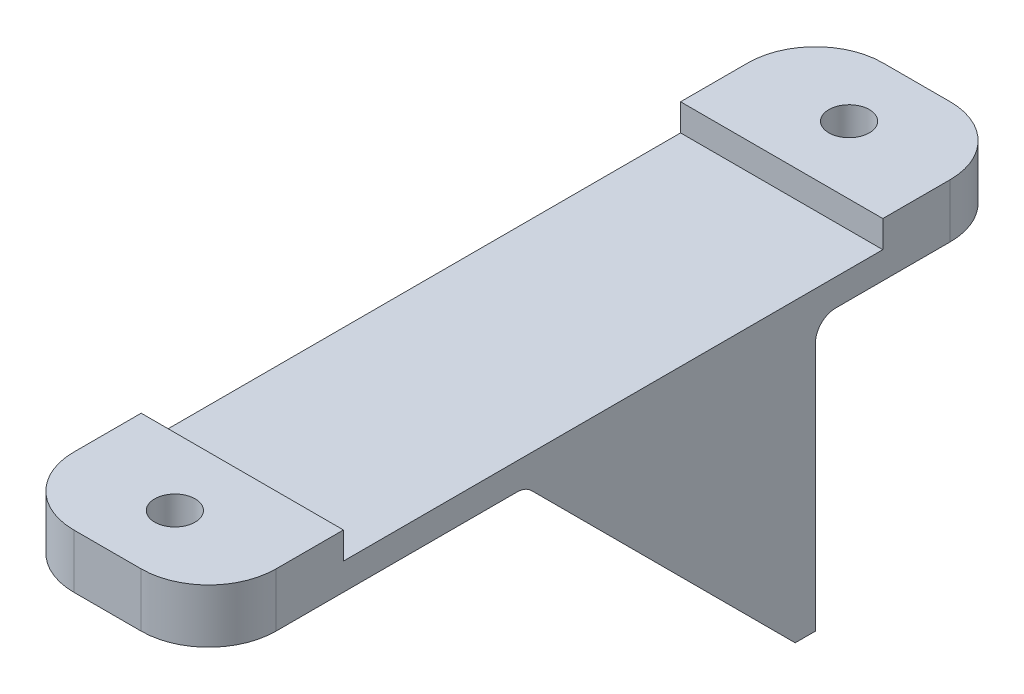
ISO-10303-21;
HEADER;
FILE_DESCRIPTION(('STEP AP214'),'2;1');
FILE_NAME('part.step','',(''),(''),'','','');
FILE_SCHEMA(('AUTOMOTIVE_DESIGN { 1 0 10303 214 1 1 1 1 }'));
ENDSEC;
DATA;
#1=APPLICATION_CONTEXT('core data for automotive mechanical design processes');
#2=APPLICATION_PROTOCOL_DEFINITION('international standard','automotive_design',2000,#1);
#3=PRODUCT_CONTEXT('',#1,'mechanical');
#4=PRODUCT('Part','Part','',(#3));
#5=PRODUCT_RELATED_PRODUCT_CATEGORY('part','',(#4));
#6=PRODUCT_DEFINITION_FORMATION('','',#4);
#7=PRODUCT_DEFINITION_CONTEXT('part definition',#1,'design');
#8=PRODUCT_DEFINITION('design','',#6,#7);
#9=PRODUCT_DEFINITION_SHAPE('','',#8);
#10=(LENGTH_UNIT() NAMED_UNIT(*) SI_UNIT(.MILLI.,.METRE.));
#11=(NAMED_UNIT(*) PLANE_ANGLE_UNIT() SI_UNIT($,.RADIAN.));
#12=(NAMED_UNIT(*) SI_UNIT($,.STERADIAN.) SOLID_ANGLE_UNIT());
#13=UNCERTAINTY_MEASURE_WITH_UNIT(LENGTH_MEASURE(1.E-05),#10,'distance_accuracy_value','');
#14=(GEOMETRIC_REPRESENTATION_CONTEXT(3) GLOBAL_UNCERTAINTY_ASSIGNED_CONTEXT((#13)) GLOBAL_UNIT_ASSIGNED_CONTEXT((#10,
#11,#12)) REPRESENTATION_CONTEXT('',''));
#15=CARTESIAN_POINT('',(0.,0.,0.));
#16=DIRECTION('',(0.,0.,1.));
#17=DIRECTION('',(1.,0.,0.));
#18=AXIS2_PLACEMENT_3D('',#15,#16,#17);
#19=CARTESIAN_POINT('',(0.,-40.,-87.));
#20=DIRECTION('',(0.,0.,-1.));
#21=DIRECTION('',(-1.,0.,0.));
#22=AXIS2_PLACEMENT_3D('',#19,#20,#21);
#23=PLANE('',#22);
#24=CARTESIAN_POINT('',(15.,-20.,-87.));
#25=DIRECTION('',(0.,0.,1.));
#26=DIRECTION('',(1.,0.,0.));
#27=AXIS2_PLACEMENT_3D('',#24,#25,#26);
#28=CIRCLE('',#27,8.75);
#29=CARTESIAN_POINT('',(23.75,-20.,-87.));
#30=VERTEX_POINT('',#29);
#31=EDGE_CURVE('E226',#30,#30,#28,.T.);
#32=ORIENTED_EDGE('',*,*,#31,.F.);
#33=EDGE_LOOP('',(#32));
#34=FACE_BOUND('',#33,.T.);
#35=DIRECTION('',(0.,-1.,0.));
#36=VECTOR('',#35,1.);
#37=CARTESIAN_POINT('',(2.5,-40.,-87.));
#38=LINE('',#37,#36);
#39=CARTESIAN_POINT('',(2.5,0.,-87.));
#40=VERTEX_POINT('',#39);
#41=CARTESIAN_POINT('',(2.5,-40.,-87.));
#42=VERTEX_POINT('',#41);
#43=EDGE_CURVE('E192',#40,#42,#38,.T.);
#44=ORIENTED_EDGE('',*,*,#43,.T.);
#45=DIRECTION('',(-1.,0.,0.));
#46=VECTOR('',#45,1.);
#47=CARTESIAN_POINT('',(0.,-40.,-87.));
#48=LINE('',#47,#46);
#49=CARTESIAN_POINT('',(27.5,-40.,-87.));
#50=VERTEX_POINT('',#49);
#51=EDGE_CURVE('E435',#50,#42,#48,.T.);
#52=ORIENTED_EDGE('',*,*,#51,.F.);
#53=DIRECTION('',(0.,1.,0.));
#54=VECTOR('',#53,1.);
#55=CARTESIAN_POINT('',(27.5,0.,-87.));
#56=LINE('',#55,#54);
#57=CARTESIAN_POINT('',(27.5,0.,-87.));
#58=VERTEX_POINT('',#57);
#59=EDGE_CURVE('E215',#50,#58,#56,.T.);
#60=ORIENTED_EDGE('',*,*,#59,.T.);
#61=DIRECTION('',(-1.,0.,0.));
#62=VECTOR('',#61,1.);
#63=CARTESIAN_POINT('',(0.,0.,-87.));
#64=LINE('',#63,#62);
#65=EDGE_CURVE('E207',#58,#40,#64,.T.);
#66=ORIENTED_EDGE('',*,*,#65,.T.);
#67=EDGE_LOOP('',(#44,#52,#60,#66));
#68=FACE_BOUND('',#67,.T.);
#69=ADVANCED_FACE('F45',(#34,#68),#23,.F.);
#70=CARTESIAN_POINT('',(0.,0.,0.));
#71=DIRECTION('',(0.,-1.,0.));
#72=DIRECTION('',(0.,0.,-1.));
#73=AXIS2_PLACEMENT_3D('',#70,#71,#72);
#74=PLANE('',#73);
#75=CARTESIAN_POINT('',(15.,0.,-10.));
#76=DIRECTION('',(0.,-1.,0.));
#77=DIRECTION('',(0.,0.,-1.));
#78=AXIS2_PLACEMENT_3D('',#75,#76,#77);
#79=CIRCLE('',#78,3.);
#80=CARTESIAN_POINT('',(15.,0.,-13.));
#81=VERTEX_POINT('',#80);
#82=EDGE_CURVE('E593',#81,#81,#79,.T.);
#83=ORIENTED_EDGE('',*,*,#82,.F.);
#84=EDGE_LOOP('',(#83));
#85=FACE_BOUND('',#84,.T.);
#86=DIRECTION('',(0.,0.,1.));
#87=VECTOR('',#86,1.);
#88=CARTESIAN_POINT('',(27.5,0.,-46.9999999999996));
#89=LINE('',#88,#87);
#90=CARTESIAN_POINT('',(27.5,0.,-45.7573593128803));
#91=VERTEX_POINT('',#90);
#92=EDGE_CURVE('E420',#58,#91,#89,.T.);
#93=ORIENTED_EDGE('',*,*,#92,.T.);
#94=DIRECTION('',(1.,0.,0.));
#95=VECTOR('',#94,1.);
#96=CARTESIAN_POINT('',(30.,0.,-45.7573593128803));
#97=LINE('',#96,#95);
#98=CARTESIAN_POINT('',(30.,0.,-45.7573593128803));
#99=VERTEX_POINT('',#98);
#100=EDGE_CURVE('E380',#91,#99,#97,.T.);
#101=ORIENTED_EDGE('',*,*,#100,.T.);
#102=DIRECTION('',(0.,0.,-1.));
#103=VECTOR('',#102,1.);
#104=CARTESIAN_POINT('',(30.,0.,0.));
#105=LINE('',#104,#103);
#106=CARTESIAN_POINT('',(30.,0.,-10.));
#107=VERTEX_POINT('',#106);
#108=EDGE_CURVE('E304',#107,#99,#105,.T.);
#109=ORIENTED_EDGE('',*,*,#108,.F.);
#110=CARTESIAN_POINT('',(20.,0.,-10.));
#111=DIRECTION('',(0.,-1.,0.));
#112=DIRECTION('',(0.,0.,-1.));
#113=AXIS2_PLACEMENT_3D('',#110,#111,#112);
#114=CIRCLE('',#113,10.);
#115=CARTESIAN_POINT('',(20.,0.,0.));
#116=VERTEX_POINT('',#115);
#117=EDGE_CURVE('E349',#107,#116,#114,.T.);
#118=ORIENTED_EDGE('',*,*,#117,.T.);
#119=DIRECTION('',(1.,0.,0.));
#120=VECTOR('',#119,1.);
#121=CARTESIAN_POINT('',(0.,0.,0.));
#122=LINE('',#121,#120);
#123=CARTESIAN_POINT('',(10.,0.,0.));
#124=VERTEX_POINT('',#123);
#125=EDGE_CURVE('E299',#124,#116,#122,.T.);
#126=ORIENTED_EDGE('',*,*,#125,.F.);
#127=CARTESIAN_POINT('',(10.,0.,-10.));
#128=DIRECTION('',(0.,-1.,0.));
#129=DIRECTION('',(0.,0.,-1.));
#130=AXIS2_PLACEMENT_3D('',#127,#128,#129);
#131=CIRCLE('',#130,10.);
#132=CARTESIAN_POINT('',(0.,0.,-10.));
#133=VERTEX_POINT('',#132);
#134=EDGE_CURVE('E345',#124,#133,#131,.T.);
#135=ORIENTED_EDGE('',*,*,#134,.T.);
#136=DIRECTION('',(0.,0.,1.));
#137=VECTOR('',#136,1.);
#138=CARTESIAN_POINT('',(0.,0.,0.));
#139=LINE('',#138,#137);
#140=CARTESIAN_POINT('',(0.,0.,-45.7573593128803));
#141=VERTEX_POINT('',#140);
#142=EDGE_CURVE('E268',#141,#133,#139,.T.);
#143=ORIENTED_EDGE('',*,*,#142,.F.);
#144=DIRECTION('',(-1.,0.,0.));
#145=VECTOR('',#144,1.);
#146=CARTESIAN_POINT('',(2.5,0.,-45.7573593128803));
#147=LINE('',#146,#145);
#148=CARTESIAN_POINT('',(2.5,0.,-45.7573593128803));
#149=VERTEX_POINT('',#148);
#150=EDGE_CURVE('E209',#141,#149,#147,.F.);
#151=ORIENTED_EDGE('',*,*,#150,.T.);
#152=DIRECTION('',(0.,0.,-1.));
#153=VECTOR('',#152,1.);
#154=CARTESIAN_POINT('',(2.5,0.,-87.));
#155=LINE('',#154,#153);
#156=EDGE_CURVE('E195',#149,#40,#155,.T.);
#157=ORIENTED_EDGE('',*,*,#156,.T.);
#158=ORIENTED_EDGE('',*,*,#65,.F.);
#159=EDGE_LOOP('',(#93,#101,#109,#118,#126,#135,#143,#151,#157,#158));
#160=FACE_BOUND('',#159,.T.);
#161=ADVANCED_FACE('F206',(#85,#160),#74,.T.);
#162=CARTESIAN_POINT('',(0.,8.,0.));
#163=DIRECTION('',(0.,-1.,0.));
#164=DIRECTION('',(0.,0.,-1.));
#165=AXIS2_PLACEMENT_3D('',#162,#163,#164);
#166=PLANE('',#165);
#167=CARTESIAN_POINT('',(15.,8.,-110.));
#168=DIRECTION('',(0.,-1.,0.));
#169=DIRECTION('',(0.,0.,-1.));
#170=AXIS2_PLACEMENT_3D('',#167,#168,#169);
#171=CIRCLE('',#170,3.);
#172=CARTESIAN_POINT('',(15.,8.,-113.));
#173=VERTEX_POINT('',#172);
#174=EDGE_CURVE('E586',#173,#173,#171,.T.);
#175=ORIENTED_EDGE('',*,*,#174,.T.);
#176=EDGE_LOOP('',(#175));
#177=FACE_BOUND('',#176,.T.);
#178=DIRECTION('',(0.,0.,-1.));
#179=VECTOR('',#178,1.);
#180=CARTESIAN_POINT('',(30.,8.,0.));
#181=LINE('',#180,#179);
#182=CARTESIAN_POINT('',(30.,8.,-100.));
#183=VERTEX_POINT('',#182);
#184=CARTESIAN_POINT('',(30.,8.,-110.));
#185=VERTEX_POINT('',#184);
#186=EDGE_CURVE('E286',#183,#185,#181,.T.);
#187=ORIENTED_EDGE('',*,*,#186,.T.);
#188=CARTESIAN_POINT('',(20.,8.,-110.));
#189=DIRECTION('',(0.,-1.,0.));
#190=DIRECTION('',(0.,0.,-1.));
#191=AXIS2_PLACEMENT_3D('',#188,#189,#190);
#192=CIRCLE('',#191,10.);
#193=CARTESIAN_POINT('',(20.,8.,-120.));
#194=VERTEX_POINT('',#193);
#195=EDGE_CURVE('E335',#185,#194,#192,.F.);
#196=ORIENTED_EDGE('',*,*,#195,.T.);
#197=DIRECTION('',(-1.,0.,0.));
#198=VECTOR('',#197,1.);
#199=CARTESIAN_POINT('',(0.,8.,-120.));
#200=LINE('',#199,#198);
#201=CARTESIAN_POINT('',(10.,8.,-120.));
#202=VERTEX_POINT('',#201);
#203=EDGE_CURVE('E290',#194,#202,#200,.T.);
#204=ORIENTED_EDGE('',*,*,#203,.T.);
#205=CARTESIAN_POINT('',(10.,8.,-110.));
#206=DIRECTION('',(0.,-1.,0.));
#207=DIRECTION('',(0.,0.,-1.));
#208=AXIS2_PLACEMENT_3D('',#205,#206,#207);
#209=CIRCLE('',#208,10.);
#210=CARTESIAN_POINT('',(0.,8.,-110.));
#211=VERTEX_POINT('',#210);
#212=EDGE_CURVE('E332',#202,#211,#209,.F.);
#213=ORIENTED_EDGE('',*,*,#212,.T.);
#214=DIRECTION('',(0.,0.,1.));
#215=VECTOR('',#214,1.);
#216=CARTESIAN_POINT('',(0.,8.,0.));
#217=LINE('',#216,#215);
#218=CARTESIAN_POINT('',(0.,8.,-100.));
#219=VERTEX_POINT('',#218);
#220=EDGE_CURVE('E278',#211,#219,#217,.T.);
#221=ORIENTED_EDGE('',*,*,#220,.T.);
#222=DIRECTION('',(-1.,0.,0.));
#223=VECTOR('',#222,1.);
#224=CARTESIAN_POINT('',(30.,8.,-100.));
#225=LINE('',#224,#223);
#226=EDGE_CURVE('E246',#183,#219,#225,.T.);
#227=ORIENTED_EDGE('',*,*,#226,.F.);
#228=EDGE_LOOP('',(#187,#196,#204,#213,#221,#227));
#229=FACE_BOUND('',#228,.T.);
#230=ADVANCED_FACE('F491',(#177,#229),#166,.F.);
#231=CARTESIAN_POINT('',(0.,8.,0.));
#232=DIRECTION('',(1.,0.,0.));
#233=DIRECTION('',(0.,0.,-1.));
#234=AXIS2_PLACEMENT_3D('',#231,#232,#233);
#235=PLANE('',#234);
#236=ORIENTED_EDGE('',*,*,#220,.F.);
#237=DIRECTION('',(0.,-1.,0.));
#238=VECTOR('',#237,1.);
#239=CARTESIAN_POINT('',(0.,8.,-110.));
#240=LINE('',#239,#238);
#241=CARTESIAN_POINT('',(0.,0.,-110.));
#242=VERTEX_POINT('',#241);
#243=EDGE_CURVE('E341',#211,#242,#240,.T.);
#244=ORIENTED_EDGE('',*,*,#243,.T.);
#245=CARTESIAN_POINT('',(0.,0.,-93.));
#246=VERTEX_POINT('',#245);
#247=EDGE_CURVE('E295',#242,#246,#139,.T.);
#248=ORIENTED_EDGE('',*,*,#247,.T.);
#249=CARTESIAN_POINT('',(0.,-3.,-93.));
#250=DIRECTION('',(1.,0.,0.));
#251=DIRECTION('',(0.,0.,-1.));
#252=AXIS2_PLACEMENT_3D('',#249,#250,#251);
#253=CIRCLE('',#252,3.);
#254=CARTESIAN_POINT('',(0.,-3.,-90.));
#255=VERTEX_POINT('',#254);
#256=EDGE_CURVE('E375',#246,#255,#253,.T.);
#257=ORIENTED_EDGE('',*,*,#256,.T.);
#258=DIRECTION('',(0.,1.,0.));
#259=VECTOR('',#258,1.);
#260=CARTESIAN_POINT('',(0.,-40.,-90.));
#261=LINE('',#260,#259);
#262=CARTESIAN_POINT('',(0.,-40.,-90.));
#263=VERTEX_POINT('',#262);
#264=EDGE_CURVE('E236',#263,#255,#261,.T.);
#265=ORIENTED_EDGE('',*,*,#264,.F.);
#266=DIRECTION('',(0.,0.,-1.));
#267=VECTOR('',#266,1.);
#268=CARTESIAN_POINT('',(0.,-40.,-87.));
#269=LINE('',#268,#267);
#270=CARTESIAN_POINT('',(0.,-40.,-87.));
#271=VERTEX_POINT('',#270);
#272=EDGE_CURVE('E217',#271,#263,#269,.T.);
#273=ORIENTED_EDGE('',*,*,#272,.F.);
#274=DIRECTION('',(0.,0.707106781186544,0.707106781186551));
#275=VECTOR('',#274,1.);
#276=CARTESIAN_POINT('',(0.,0.,-46.9999999999996));
#277=LINE('',#276,#275);
#278=CARTESIAN_POINT('',(0.,-0.878679656440344,-47.8786796564399));
#279=VERTEX_POINT('',#278);
#280=EDGE_CURVE('E211',#271,#279,#277,.T.);
#281=ORIENTED_EDGE('',*,*,#280,.T.);
#282=CARTESIAN_POINT('',(0.,-3.,-45.7573593128803));
#283=DIRECTION('',(1.,0.,0.));
#284=DIRECTION('',(0.,0.,-1.));
#285=AXIS2_PLACEMENT_3D('',#282,#283,#284);
#286=CIRCLE('',#285,3.);
#287=EDGE_CURVE('E54',#279,#141,#286,.T.);
#288=ORIENTED_EDGE('',*,*,#287,.T.);
#289=ORIENTED_EDGE('',*,*,#142,.T.);
#290=DIRECTION('',(0.,-1.,0.));
#291=VECTOR('',#290,1.);
#292=CARTESIAN_POINT('',(0.,8.,-10.));
#293=LINE('',#292,#291);
#294=CARTESIAN_POINT('',(0.,8.,-10.));
#295=VERTEX_POINT('',#294);
#296=EDGE_CURVE('E338',#133,#295,#293,.F.);
#297=ORIENTED_EDGE('',*,*,#296,.T.);
#298=CARTESIAN_POINT('',(0.,8.,-20.));
#299=VERTEX_POINT('',#298);
#300=EDGE_CURVE('E282',#299,#295,#217,.T.);
#301=ORIENTED_EDGE('',*,*,#300,.F.);
#302=DIRECTION('',(0.,1.,0.));
#303=VECTOR('',#302,1.);
#304=CARTESIAN_POINT('',(0.,4.,-20.));
#305=LINE('',#304,#303);
#306=CARTESIAN_POINT('',(0.,4.,-20.));
#307=VERTEX_POINT('',#306);
#308=EDGE_CURVE('E257',#307,#299,#305,.T.);
#309=ORIENTED_EDGE('',*,*,#308,.F.);
#310=DIRECTION('',(0.,0.,1.));
#311=VECTOR('',#310,1.);
#312=CARTESIAN_POINT('',(0.,4.,-100.));
#313=LINE('',#312,#311);
#314=CARTESIAN_POINT('',(0.,4.,-100.));
#315=VERTEX_POINT('',#314);
#316=EDGE_CURVE('E241',#315,#307,#313,.T.);
#317=ORIENTED_EDGE('',*,*,#316,.F.);
#318=DIRECTION('',(0.,1.,0.));
#319=VECTOR('',#318,1.);
#320=CARTESIAN_POINT('',(0.,4.,-100.));
#321=LINE('',#320,#319);
#322=EDGE_CURVE('E264',#315,#219,#321,.T.);
#323=ORIENTED_EDGE('',*,*,#322,.T.);
#324=EDGE_LOOP('',(#236,#244,#248,#257,#265,#273,#281,#288,#289,#297,#301,#309,#317,#323));
#325=FACE_BOUND('',#324,.T.);
#326=ADVANCED_FACE('F400',(#325),#235,.F.);
#327=CARTESIAN_POINT('',(0.,8.,0.));
#328=DIRECTION('',(0.,0.,-1.));
#329=DIRECTION('',(-1.,0.,0.));
#330=AXIS2_PLACEMENT_3D('',#327,#328,#329);
#331=PLANE('',#330);
#332=ORIENTED_EDGE('',*,*,#125,.T.);
#333=DIRECTION('',(0.,-1.,0.));
#334=VECTOR('',#333,1.);
#335=CARTESIAN_POINT('',(20.,8.,0.));
#336=LINE('',#335,#334);
#337=CARTESIAN_POINT('',(20.,8.,0.));
#338=VERTEX_POINT('',#337);
#339=EDGE_CURVE('E356',#116,#338,#336,.F.);
#340=ORIENTED_EDGE('',*,*,#339,.T.);
#341=DIRECTION('',(1.,0.,0.));
#342=VECTOR('',#341,1.);
#343=CARTESIAN_POINT('',(0.,8.,0.));
#344=LINE('',#343,#342);
#345=CARTESIAN_POINT('',(10.,8.,0.));
#346=VERTEX_POINT('',#345);
#347=EDGE_CURVE('E281',#346,#338,#344,.T.);
#348=ORIENTED_EDGE('',*,*,#347,.F.);
#349=DIRECTION('',(0.,-1.,0.));
#350=VECTOR('',#349,1.);
#351=CARTESIAN_POINT('',(10.,8.,0.));
#352=LINE('',#351,#350);
#353=EDGE_CURVE('E352',#346,#124,#352,.T.);
#354=ORIENTED_EDGE('',*,*,#353,.T.);
#355=EDGE_LOOP('',(#332,#340,#348,#354));
#356=FACE_BOUND('',#355,.T.);
#357=ADVANCED_FACE('F463',(#356),#331,.F.);
#358=CARTESIAN_POINT('',(30.,8.,0.));
#359=DIRECTION('',(-1.,0.,0.));
#360=DIRECTION('',(0.,0.,1.));
#361=AXIS2_PLACEMENT_3D('',#358,#359,#360);
#362=PLANE('',#361);
#363=DIRECTION('',(0.,1.,0.));
#364=VECTOR('',#363,1.);
#365=CARTESIAN_POINT('',(30.,-40.,-90.));
#366=LINE('',#365,#364);
#367=CARTESIAN_POINT('',(30.,-40.,-90.));
#368=VERTEX_POINT('',#367);
#369=CARTESIAN_POINT('',(30.,-3.,-90.));
#370=VERTEX_POINT('',#369);
#371=EDGE_CURVE('E232',#368,#370,#366,.T.);
#372=ORIENTED_EDGE('',*,*,#371,.T.);
#373=CARTESIAN_POINT('',(30.,-3.,-93.));
#374=DIRECTION('',(-1.,0.,0.));
#375=DIRECTION('',(0.,0.,1.));
#376=AXIS2_PLACEMENT_3D('',#373,#374,#375);
#377=CIRCLE('',#376,3.);
#378=CARTESIAN_POINT('',(30.,0.,-93.));
#379=VERTEX_POINT('',#378);
#380=EDGE_CURVE('E372',#370,#379,#377,.T.);
#381=ORIENTED_EDGE('',*,*,#380,.T.);
#382=CARTESIAN_POINT('',(30.,0.,-110.));
#383=VERTEX_POINT('',#382);
#384=EDGE_CURVE('E303',#379,#383,#105,.T.);
#385=ORIENTED_EDGE('',*,*,#384,.T.);
#386=DIRECTION('',(0.,-1.,0.));
#387=VECTOR('',#386,1.);
#388=CARTESIAN_POINT('',(30.,8.,-110.));
#389=LINE('',#388,#387);
#390=EDGE_CURVE('E329',#383,#185,#389,.F.);
#391=ORIENTED_EDGE('',*,*,#390,.T.);
#392=ORIENTED_EDGE('',*,*,#186,.F.);
#393=DIRECTION('',(0.,1.,0.));
#394=VECTOR('',#393,1.);
#395=CARTESIAN_POINT('',(30.,4.,-100.));
#396=LINE('',#395,#394);
#397=CARTESIAN_POINT('',(30.,4.,-100.));
#398=VERTEX_POINT('',#397);
#399=EDGE_CURVE('E269',#398,#183,#396,.T.);
#400=ORIENTED_EDGE('',*,*,#399,.F.);
#401=DIRECTION('',(0.,0.,-1.));
#402=VECTOR('',#401,1.);
#403=CARTESIAN_POINT('',(30.,4.,-100.));
#404=LINE('',#403,#402);
#405=CARTESIAN_POINT('',(30.,4.,-20.));
#406=VERTEX_POINT('',#405);
#407=EDGE_CURVE('E250',#406,#398,#404,.T.);
#408=ORIENTED_EDGE('',*,*,#407,.F.);
#409=DIRECTION('',(0.,1.,0.));
#410=VECTOR('',#409,1.);
#411=CARTESIAN_POINT('',(30.,4.,-20.));
#412=LINE('',#411,#410);
#413=CARTESIAN_POINT('',(30.,8.,-20.));
#414=VERTEX_POINT('',#413);
#415=EDGE_CURVE('E272',#406,#414,#412,.T.);
#416=ORIENTED_EDGE('',*,*,#415,.T.);
#417=CARTESIAN_POINT('',(30.,8.,-10.));
#418=VERTEX_POINT('',#417);
#419=EDGE_CURVE('E287',#418,#414,#181,.T.);
#420=ORIENTED_EDGE('',*,*,#419,.F.);
#421=DIRECTION('',(0.,-1.,0.));
#422=VECTOR('',#421,1.);
#423=CARTESIAN_POINT('',(30.,8.,-10.));
#424=LINE('',#423,#422);
#425=EDGE_CURVE('E325',#418,#107,#424,.T.);
#426=ORIENTED_EDGE('',*,*,#425,.T.);
#427=ORIENTED_EDGE('',*,*,#108,.T.);
#428=CARTESIAN_POINT('',(30.,-3.,-45.7573593128803));
#429=DIRECTION('',(-1.,0.,0.));
#430=DIRECTION('',(0.,0.,1.));
#431=AXIS2_PLACEMENT_3D('',#428,#429,#430);
#432=CIRCLE('',#431,3.);
#433=CARTESIAN_POINT('',(30.,-0.878679656440354,-47.8786796564399));
#434=VERTEX_POINT('',#433);
#435=EDGE_CURVE('E390',#99,#434,#432,.T.);
#436=ORIENTED_EDGE('',*,*,#435,.T.);
#437=DIRECTION('',(0.,-0.707106781186544,-0.707106781186551));
#438=VECTOR('',#437,1.);
#439=CARTESIAN_POINT('',(30.,-40.,-87.));
#440=LINE('',#439,#438);
#441=CARTESIAN_POINT('',(30.,-40.,-87.));
#442=VERTEX_POINT('',#441);
#443=EDGE_CURVE('E412',#434,#442,#440,.T.);
#444=ORIENTED_EDGE('',*,*,#443,.T.);
#445=DIRECTION('',(0.,0.,1.));
#446=VECTOR('',#445,1.);
#447=CARTESIAN_POINT('',(30.,-40.,-87.));
#448=LINE('',#447,#446);
#449=EDGE_CURVE('E432',#368,#442,#448,.T.);
#450=ORIENTED_EDGE('',*,*,#449,.F.);
#451=EDGE_LOOP('',(#372,#381,#385,#391,#392,#400,#408,#416,#420,#426,#427,#436,#444,#450));
#452=FACE_BOUND('',#451,.T.);
#453=ADVANCED_FACE('F455',(#452),#362,.F.);
#454=CARTESIAN_POINT('',(0.,8.,-120.));
#455=DIRECTION('',(0.,0.,1.));
#456=DIRECTION('',(1.,0.,0.));
#457=AXIS2_PLACEMENT_3D('',#454,#455,#456);
#458=PLANE('',#457);
#459=ORIENTED_EDGE('',*,*,#203,.F.);
#460=DIRECTION('',(0.,-1.,0.));
#461=VECTOR('',#460,1.);
#462=CARTESIAN_POINT('',(20.,8.,-120.));
#463=LINE('',#462,#461);
#464=CARTESIAN_POINT('',(20.,0.,-120.));
#465=VERTEX_POINT('',#464);
#466=EDGE_CURVE('E314',#194,#465,#463,.T.);
#467=ORIENTED_EDGE('',*,*,#466,.T.);
#468=DIRECTION('',(-1.,0.,0.));
#469=VECTOR('',#468,1.);
#470=CARTESIAN_POINT('',(0.,0.,-120.));
#471=LINE('',#470,#469);
#472=CARTESIAN_POINT('',(10.,0.,-120.));
#473=VERTEX_POINT('',#472);
#474=EDGE_CURVE('E308',#465,#473,#471,.T.);
#475=ORIENTED_EDGE('',*,*,#474,.T.);
#476=DIRECTION('',(0.,-1.,0.));
#477=VECTOR('',#476,1.);
#478=CARTESIAN_POINT('',(10.,8.,-120.));
#479=LINE('',#478,#477);
#480=EDGE_CURVE('E294',#473,#202,#479,.F.);
#481=ORIENTED_EDGE('',*,*,#480,.T.);
#482=EDGE_LOOP('',(#459,#467,#475,#481));
#483=FACE_BOUND('',#482,.T.);
#484=ADVANCED_FACE('F495',(#483),#458,.F.);
#485=CARTESIAN_POINT('',(15.,8.,-10.));
#486=DIRECTION('',(0.,-1.,0.));
#487=DIRECTION('',(0.,0.,-1.));
#488=AXIS2_PLACEMENT_3D('',#485,#486,#487);
#489=CIRCLE('',#488,3.);
#490=CARTESIAN_POINT('',(15.,8.,-13.));
#491=VERTEX_POINT('',#490);
#492=EDGE_CURVE('E416',#491,#491,#489,.T.);
#493=ORIENTED_EDGE('',*,*,#492,.T.);
#494=EDGE_LOOP('',(#493));
#495=FACE_BOUND('',#494,.T.);
#496=ORIENTED_EDGE('',*,*,#347,.T.);
#497=CARTESIAN_POINT('',(20.,8.,-10.));
#498=DIRECTION('',(0.,-1.,0.));
#499=DIRECTION('',(0.,0.,-1.));
#500=AXIS2_PLACEMENT_3D('',#497,#498,#499);
#501=CIRCLE('',#500,10.);
#502=EDGE_CURVE('E362',#338,#418,#501,.F.);
#503=ORIENTED_EDGE('',*,*,#502,.T.);
#504=ORIENTED_EDGE('',*,*,#419,.T.);
#505=DIRECTION('',(1.,0.,0.));
#506=VECTOR('',#505,1.);
#507=CARTESIAN_POINT('',(30.,8.,-20.));
#508=LINE('',#507,#506);
#509=EDGE_CURVE('E240',#299,#414,#508,.T.);
#510=ORIENTED_EDGE('',*,*,#509,.F.);
#511=ORIENTED_EDGE('',*,*,#300,.T.);
#512=CARTESIAN_POINT('',(10.,8.,-10.));
#513=DIRECTION('',(0.,-1.,0.));
#514=DIRECTION('',(0.,0.,-1.));
#515=AXIS2_PLACEMENT_3D('',#512,#513,#514);
#516=CIRCLE('',#515,10.);
#517=EDGE_CURVE('E359',#295,#346,#516,.F.);
#518=ORIENTED_EDGE('',*,*,#517,.T.);
#519=EDGE_LOOP('',(#496,#503,#504,#510,#511,#518));
#520=FACE_BOUND('',#519,.T.);
#521=ADVANCED_FACE('F474',(#495,#520),#166,.F.);
#522=CARTESIAN_POINT('',(15.,0.,-110.));
#523=DIRECTION('',(0.,-1.,0.));
#524=DIRECTION('',(0.,0.,-1.));
#525=AXIS2_PLACEMENT_3D('',#522,#523,#524);
#526=CIRCLE('',#525,3.);
#527=CARTESIAN_POINT('',(15.,0.,-113.));
#528=VERTEX_POINT('',#527);
#529=EDGE_CURVE('E589',#528,#528,#526,.T.);
#530=ORIENTED_EDGE('',*,*,#529,.F.);
#531=EDGE_LOOP('',(#530));
#532=FACE_BOUND('',#531,.T.);
#533=ORIENTED_EDGE('',*,*,#384,.F.);
#534=DIRECTION('',(1.,0.,0.));
#535=VECTOR('',#534,1.);
#536=CARTESIAN_POINT('',(0.,0.,-93.));
#537=LINE('',#536,#535);
#538=EDGE_CURVE('E369',#379,#246,#537,.F.);
#539=ORIENTED_EDGE('',*,*,#538,.T.);
#540=ORIENTED_EDGE('',*,*,#247,.F.);
#541=CARTESIAN_POINT('',(10.,0.,-110.));
#542=DIRECTION('',(0.,-1.,0.));
#543=DIRECTION('',(0.,0.,-1.));
#544=AXIS2_PLACEMENT_3D('',#541,#542,#543);
#545=CIRCLE('',#544,10.);
#546=EDGE_CURVE('E318',#242,#473,#545,.T.);
#547=ORIENTED_EDGE('',*,*,#546,.T.);
#548=ORIENTED_EDGE('',*,*,#474,.F.);
#549=CARTESIAN_POINT('',(20.,0.,-110.));
#550=DIRECTION('',(0.,-1.,0.));
#551=DIRECTION('',(0.,0.,-1.));
#552=AXIS2_PLACEMENT_3D('',#549,#550,#551);
#553=CIRCLE('',#552,10.);
#554=EDGE_CURVE('E321',#465,#383,#553,.T.);
#555=ORIENTED_EDGE('',*,*,#554,.T.);
#556=EDGE_LOOP('',(#533,#539,#540,#547,#548,#555));
#557=FACE_BOUND('',#556,.T.);
#558=ADVANCED_FACE('F484',(#532,#557),#74,.T.);
#559=CARTESIAN_POINT('',(30.,4.,-100.));
#560=DIRECTION('',(0.,0.,-1.));
#561=DIRECTION('',(-1.,0.,0.));
#562=AXIS2_PLACEMENT_3D('',#559,#560,#561);
#563=PLANE('',#562);
#564=ORIENTED_EDGE('',*,*,#226,.T.);
#565=ORIENTED_EDGE('',*,*,#322,.F.);
#566=DIRECTION('',(-1.,0.,0.));
#567=VECTOR('',#566,1.);
#568=CARTESIAN_POINT('',(30.,4.,-100.));
#569=LINE('',#568,#567);
#570=EDGE_CURVE('E253',#398,#315,#569,.T.);
#571=ORIENTED_EDGE('',*,*,#570,.F.);
#572=ORIENTED_EDGE('',*,*,#399,.T.);
#573=EDGE_LOOP('',(#564,#565,#571,#572));
#574=FACE_BOUND('',#573,.T.);
#575=ADVANCED_FACE('F504',(#574),#563,.F.);
#576=CARTESIAN_POINT('',(30.,4.,-20.));
#577=DIRECTION('',(0.,0.,1.));
#578=DIRECTION('',(1.,0.,0.));
#579=AXIS2_PLACEMENT_3D('',#576,#577,#578);
#580=PLANE('',#579);
#581=ORIENTED_EDGE('',*,*,#509,.T.);
#582=ORIENTED_EDGE('',*,*,#415,.F.);
#583=DIRECTION('',(1.,0.,0.));
#584=VECTOR('',#583,1.);
#585=CARTESIAN_POINT('',(30.,4.,-20.));
#586=LINE('',#585,#584);
#587=EDGE_CURVE('E245',#307,#406,#586,.T.);
#588=ORIENTED_EDGE('',*,*,#587,.F.);
#589=ORIENTED_EDGE('',*,*,#308,.T.);
#590=EDGE_LOOP('',(#581,#582,#588,#589));
#591=FACE_BOUND('',#590,.T.);
#592=ADVANCED_FACE('F511',(#591),#580,.F.);
#593=CARTESIAN_POINT('',(0.,4.,0.));
#594=DIRECTION('',(0.,-1.,0.));
#595=DIRECTION('',(0.,0.,-1.));
#596=AXIS2_PLACEMENT_3D('',#593,#594,#595);
#597=PLANE('',#596);
#598=ORIENTED_EDGE('',*,*,#316,.T.);
#599=ORIENTED_EDGE('',*,*,#587,.T.);
#600=ORIENTED_EDGE('',*,*,#407,.T.);
#601=ORIENTED_EDGE('',*,*,#570,.T.);
#602=EDGE_LOOP('',(#598,#599,#600,#601));
#603=FACE_BOUND('',#602,.T.);
#604=ADVANCED_FACE('F507',(#603),#597,.F.);
#605=CARTESIAN_POINT('',(0.,-40.,-90.));
#606=DIRECTION('',(0.,0.,1.));
#607=DIRECTION('',(1.,0.,0.));
#608=AXIS2_PLACEMENT_3D('',#605,#606,#607);
#609=PLANE('',#608);
#610=CARTESIAN_POINT('',(15.,-20.,-90.));
#611=DIRECTION('',(0.,0.,1.));
#612=DIRECTION('',(1.,0.,0.));
#613=AXIS2_PLACEMENT_3D('',#610,#611,#612);
#614=CIRCLE('',#613,8.75);
#615=CARTESIAN_POINT('',(23.75,-20.,-90.));
#616=VERTEX_POINT('',#615);
#617=EDGE_CURVE('E218',#616,#616,#614,.T.);
#618=ORIENTED_EDGE('',*,*,#617,.T.);
#619=EDGE_LOOP('',(#618));
#620=FACE_BOUND('',#619,.T.);
#621=ORIENTED_EDGE('',*,*,#264,.T.);
#622=DIRECTION('',(1.,0.,0.));
#623=VECTOR('',#622,1.);
#624=CARTESIAN_POINT('',(0.,-3.,-90.));
#625=LINE('',#624,#623);
#626=EDGE_CURVE('E365',#255,#370,#625,.T.);
#627=ORIENTED_EDGE('',*,*,#626,.T.);
#628=ORIENTED_EDGE('',*,*,#371,.F.);
#629=DIRECTION('',(1.,0.,0.));
#630=VECTOR('',#629,1.);
#631=CARTESIAN_POINT('',(0.,-40.,-90.));
#632=LINE('',#631,#630);
#633=EDGE_CURVE('E223',#263,#368,#632,.T.);
#634=ORIENTED_EDGE('',*,*,#633,.F.);
#635=EDGE_LOOP('',(#621,#627,#628,#634));
#636=FACE_BOUND('',#635,.T.);
#637=ADVANCED_FACE('F518',(#620,#636),#609,.F.);
#638=CARTESIAN_POINT('',(0.,-40.,0.));
#639=DIRECTION('',(0.,-1.,0.));
#640=DIRECTION('',(0.,0.,-1.));
#641=AXIS2_PLACEMENT_3D('',#638,#639,#640);
#642=PLANE('',#641);
#643=ORIENTED_EDGE('',*,*,#272,.T.);
#644=ORIENTED_EDGE('',*,*,#633,.T.);
#645=ORIENTED_EDGE('',*,*,#449,.T.);
#646=EDGE_CURVE('E230',#442,#50,#48,.T.);
#647=ORIENTED_EDGE('',*,*,#646,.T.);
#648=ORIENTED_EDGE('',*,*,#51,.T.);
#649=DIRECTION('',(-1.,0.,0.));
#650=VECTOR('',#649,1.);
#651=CARTESIAN_POINT('',(2.5,-40.,-87.));
#652=LINE('',#651,#650);
#653=EDGE_CURVE('E408',#42,#271,#652,.T.);
#654=ORIENTED_EDGE('',*,*,#653,.T.);
#655=EDGE_LOOP('',(#643,#644,#645,#647,#648,#654));
#656=FACE_BOUND('',#655,.T.);
#657=ADVANCED_FACE('F442',(#656),#642,.T.);
#658=CARTESIAN_POINT('',(15.,-20.,-127.));
#659=DIRECTION('',(0.,0.,1.));
#660=DIRECTION('',(1.,0.,0.));
#661=AXIS2_PLACEMENT_3D('',#658,#659,#660);
#662=CYLINDRICAL_SURFACE('',#661,8.75);
#663=ORIENTED_EDGE('',*,*,#31,.T.);
#664=EDGE_LOOP('',(#663));
#665=FACE_BOUND('',#664,.T.);
#666=ORIENTED_EDGE('',*,*,#617,.F.);
#667=EDGE_LOOP('',(#666));
#668=FACE_BOUND('',#667,.T.);
#669=ADVANCED_FACE('F542',(#665,#668),#662,.F.);
#670=CARTESIAN_POINT('',(27.5,-40.,-87.));
#671=DIRECTION('',(0.,-0.707106781186551,0.707106781186544));
#672=DIRECTION('',(0.,-0.707106781186544,-0.707106781186551));
#673=AXIS2_PLACEMENT_3D('',#670,#671,#672);
#674=PLANE('',#673);
#675=ORIENTED_EDGE('',*,*,#443,.F.);
#676=DIRECTION('',(1.,0.,0.));
#677=VECTOR('',#676,1.);
#678=CARTESIAN_POINT('',(27.5,-0.878679656440344,-47.8786796564399));
#679=LINE('',#678,#677);
#680=CARTESIAN_POINT('',(27.5,-0.878679656440354,-47.8786796564399));
#681=VERTEX_POINT('',#680);
#682=EDGE_CURVE('E384',#434,#681,#679,.F.);
#683=ORIENTED_EDGE('',*,*,#682,.T.);
#684=DIRECTION('',(0.,-0.707106781186544,-0.707106781186551));
#685=VECTOR('',#684,1.);
#686=CARTESIAN_POINT('',(27.5,-40.,-87.));
#687=LINE('',#686,#685);
#688=EDGE_CURVE('E423',#681,#50,#687,.T.);
#689=ORIENTED_EDGE('',*,*,#688,.T.);
#690=ORIENTED_EDGE('',*,*,#646,.F.);
#691=EDGE_LOOP('',(#675,#683,#689,#690));
#692=FACE_BOUND('',#691,.T.);
#693=ADVANCED_FACE('F445',(#692),#674,.T.);
#694=CARTESIAN_POINT('',(27.5,0.,0.));
#695=DIRECTION('',(1.,0.,0.));
#696=DIRECTION('',(0.,0.,-1.));
#697=AXIS2_PLACEMENT_3D('',#694,#695,#696);
#698=PLANE('',#697);
#699=ORIENTED_EDGE('',*,*,#59,.F.);
#700=ORIENTED_EDGE('',*,*,#688,.F.);
#701=CARTESIAN_POINT('',(27.5,-3.,-45.7573593128803));
#702=DIRECTION('',(1.,0.,0.));
#703=DIRECTION('',(0.,0.,-1.));
#704=AXIS2_PLACEMENT_3D('',#701,#702,#703);
#705=CIRCLE('',#704,3.);
#706=EDGE_CURVE('E393',#681,#91,#705,.T.);
#707=ORIENTED_EDGE('',*,*,#706,.T.);
#708=ORIENTED_EDGE('',*,*,#92,.F.);
#709=EDGE_LOOP('',(#699,#700,#707,#708));
#710=FACE_BOUND('',#709,.T.);
#711=ADVANCED_FACE('F450',(#710),#698,.F.);
#712=CARTESIAN_POINT('',(2.5,0.,-46.9999999999996));
#713=DIRECTION('',(0.,-0.707106781186551,0.707106781186544));
#714=DIRECTION('',(0.,-0.707106781186544,-0.707106781186551));
#715=AXIS2_PLACEMENT_3D('',#712,#713,#714);
#716=PLANE('',#715);
#717=DIRECTION('',(0.,0.707106781186544,0.707106781186551));
#718=VECTOR('',#717,1.);
#719=CARTESIAN_POINT('',(2.5,0.,-46.9999999999996));
#720=LINE('',#719,#718);
#721=CARTESIAN_POINT('',(2.5,-0.878679656440344,-47.8786796564399));
#722=VERTEX_POINT('',#721);
#723=EDGE_CURVE('E197',#42,#722,#720,.T.);
#724=ORIENTED_EDGE('',*,*,#723,.T.);
#725=DIRECTION('',(-1.,0.,0.));
#726=VECTOR('',#725,1.);
#727=CARTESIAN_POINT('',(0.,-0.878679656440345,-47.8786796564399));
#728=LINE('',#727,#726);
#729=EDGE_CURVE('E387',#722,#279,#728,.T.);
#730=ORIENTED_EDGE('',*,*,#729,.T.);
#731=ORIENTED_EDGE('',*,*,#280,.F.);
#732=ORIENTED_EDGE('',*,*,#653,.F.);
#733=EDGE_LOOP('',(#724,#730,#731,#732));
#734=FACE_BOUND('',#733,.T.);
#735=ADVANCED_FACE('F406',(#734),#716,.T.);
#736=CARTESIAN_POINT('',(2.5,0.,0.));
#737=DIRECTION('',(-1.,0.,0.));
#738=DIRECTION('',(0.,0.,1.));
#739=AXIS2_PLACEMENT_3D('',#736,#737,#738);
#740=PLANE('',#739);
#741=ORIENTED_EDGE('',*,*,#156,.F.);
#742=CARTESIAN_POINT('',(2.5,-3.,-45.7573593128803));
#743=DIRECTION('',(-1.,0.,0.));
#744=DIRECTION('',(0.,0.,1.));
#745=AXIS2_PLACEMENT_3D('',#742,#743,#744);
#746=CIRCLE('',#745,3.);
#747=EDGE_CURVE('E11',#149,#722,#746,.T.);
#748=ORIENTED_EDGE('',*,*,#747,.T.);
#749=ORIENTED_EDGE('',*,*,#723,.F.);
#750=ORIENTED_EDGE('',*,*,#43,.F.);
#751=EDGE_LOOP('',(#741,#748,#749,#750));
#752=FACE_BOUND('',#751,.T.);
#753=ADVANCED_FACE('F194',(#752),#740,.F.);
#754=CARTESIAN_POINT('',(15.,8.,-110.));
#755=DIRECTION('',(0.,-1.,0.));
#756=DIRECTION('',(0.,0.,-1.));
#757=AXIS2_PLACEMENT_3D('',#754,#755,#756);
#758=CYLINDRICAL_SURFACE('',#757,3.);
#759=ORIENTED_EDGE('',*,*,#174,.F.);
#760=EDGE_LOOP('',(#759));
#761=FACE_BOUND('',#760,.T.);
#762=ORIENTED_EDGE('',*,*,#529,.T.);
#763=EDGE_LOOP('',(#762));
#764=FACE_BOUND('',#763,.T.);
#765=ADVANCED_FACE('F603',(#761,#764),#758,.F.);
#766=CARTESIAN_POINT('',(15.,8.,-10.));
#767=DIRECTION('',(0.,-1.,0.));
#768=DIRECTION('',(0.,0.,-1.));
#769=AXIS2_PLACEMENT_3D('',#766,#767,#768);
#770=CYLINDRICAL_SURFACE('',#769,3.);
#771=ORIENTED_EDGE('',*,*,#492,.F.);
#772=EDGE_LOOP('',(#771));
#773=FACE_BOUND('',#772,.T.);
#774=ORIENTED_EDGE('',*,*,#82,.T.);
#775=EDGE_LOOP('',(#774));
#776=FACE_BOUND('',#775,.T.);
#777=ADVANCED_FACE('F565',(#773,#776),#770,.F.);
#778=CARTESIAN_POINT('',(20.,8.,-110.));
#779=DIRECTION('',(0.,-1.,0.));
#780=DIRECTION('',(0.,0.,-1.));
#781=AXIS2_PLACEMENT_3D('',#778,#779,#780);
#782=CYLINDRICAL_SURFACE('',#781,10.);
#783=ORIENTED_EDGE('',*,*,#195,.F.);
#784=ORIENTED_EDGE('',*,*,#390,.F.);
#785=ORIENTED_EDGE('',*,*,#554,.F.);
#786=ORIENTED_EDGE('',*,*,#466,.F.);
#787=EDGE_LOOP('',(#783,#784,#785,#786));
#788=FACE_BOUND('',#787,.T.);
#789=ADVANCED_FACE('F488',(#788),#782,.T.);
#790=CARTESIAN_POINT('',(10.,8.,-110.));
#791=DIRECTION('',(0.,-1.,0.));
#792=DIRECTION('',(0.,0.,-1.));
#793=AXIS2_PLACEMENT_3D('',#790,#791,#792);
#794=CYLINDRICAL_SURFACE('',#793,10.);
#795=ORIENTED_EDGE('',*,*,#212,.F.);
#796=ORIENTED_EDGE('',*,*,#480,.F.);
#797=ORIENTED_EDGE('',*,*,#546,.F.);
#798=ORIENTED_EDGE('',*,*,#243,.F.);
#799=EDGE_LOOP('',(#795,#796,#797,#798));
#800=FACE_BOUND('',#799,.T.);
#801=ADVANCED_FACE('F498',(#800),#794,.T.);
#802=CARTESIAN_POINT('',(20.,8.,-10.));
#803=DIRECTION('',(0.,-1.,0.));
#804=DIRECTION('',(0.,0.,-1.));
#805=AXIS2_PLACEMENT_3D('',#802,#803,#804);
#806=CYLINDRICAL_SURFACE('',#805,10.);
#807=ORIENTED_EDGE('',*,*,#502,.F.);
#808=ORIENTED_EDGE('',*,*,#339,.F.);
#809=ORIENTED_EDGE('',*,*,#117,.F.);
#810=ORIENTED_EDGE('',*,*,#425,.F.);
#811=EDGE_LOOP('',(#807,#808,#809,#810));
#812=FACE_BOUND('',#811,.T.);
#813=ADVANCED_FACE('F460',(#812),#806,.T.);
#814=CARTESIAN_POINT('',(10.,8.,-10.));
#815=DIRECTION('',(0.,-1.,0.));
#816=DIRECTION('',(0.,0.,-1.));
#817=AXIS2_PLACEMENT_3D('',#814,#815,#816);
#818=CYLINDRICAL_SURFACE('',#817,10.);
#819=ORIENTED_EDGE('',*,*,#517,.F.);
#820=ORIENTED_EDGE('',*,*,#296,.F.);
#821=ORIENTED_EDGE('',*,*,#134,.F.);
#822=ORIENTED_EDGE('',*,*,#353,.F.);
#823=EDGE_LOOP('',(#819,#820,#821,#822));
#824=FACE_BOUND('',#823,.T.);
#825=ADVANCED_FACE('F468',(#824),#818,.T.);
#826=CARTESIAN_POINT('',(0.,-3.,-93.));
#827=DIRECTION('',(1.,0.,0.));
#828=DIRECTION('',(0.,0.,-1.));
#829=AXIS2_PLACEMENT_3D('',#826,#827,#828);
#830=CYLINDRICAL_SURFACE('',#829,3.);
#831=ORIENTED_EDGE('',*,*,#256,.F.);
#832=ORIENTED_EDGE('',*,*,#538,.F.);
#833=ORIENTED_EDGE('',*,*,#380,.F.);
#834=ORIENTED_EDGE('',*,*,#626,.F.);
#835=EDGE_LOOP('',(#831,#832,#833,#834));
#836=FACE_BOUND('',#835,.T.);
#837=ADVANCED_FACE('F550',(#836),#830,.F.);
#838=CARTESIAN_POINT('',(0.,-3.,-45.7573593128803));
#839=DIRECTION('',(-1.,0.,0.));
#840=DIRECTION('',(0.,0.,1.));
#841=AXIS2_PLACEMENT_3D('',#838,#839,#840);
#842=CYLINDRICAL_SURFACE('',#841,3.);
#843=ORIENTED_EDGE('',*,*,#706,.F.);
#844=ORIENTED_EDGE('',*,*,#682,.F.);
#845=ORIENTED_EDGE('',*,*,#435,.F.);
#846=ORIENTED_EDGE('',*,*,#100,.F.);
#847=EDGE_LOOP('',(#843,#844,#845,#846));
#848=FACE_BOUND('',#847,.T.);
#849=ADVANCED_FACE('F551',(#848),#842,.F.);
#850=CARTESIAN_POINT('',(2.5,-3.,-45.7573593128803));
#851=DIRECTION('',(1.,0.,0.));
#852=DIRECTION('',(0.,0.,-1.));
#853=AXIS2_PLACEMENT_3D('',#850,#851,#852);
#854=CYLINDRICAL_SURFACE('',#853,3.);
#855=ORIENTED_EDGE('',*,*,#747,.F.);
#856=ORIENTED_EDGE('',*,*,#150,.F.);
#857=ORIENTED_EDGE('',*,*,#287,.F.);
#858=ORIENTED_EDGE('',*,*,#729,.F.);
#859=EDGE_LOOP('',(#855,#856,#857,#858));
#860=FACE_BOUND('',#859,.T.);
#861=ADVANCED_FACE('F47',(#860),#854,.F.);
#862=CLOSED_SHELL('',(#69,#161,#230,#326,#357,#453,#484,#521,#558,#575,#592,#604,#637,#657,#669,
#693,#711,#735,#753,#765,#777,#789,#801,#813,#825,#837,#849,#861));
#863=MANIFOLD_SOLID_BREP('B2',#862);
#864=ADVANCED_BREP_SHAPE_REPRESENTATION('',(#18,#863),#14);
#865=SHAPE_DEFINITION_REPRESENTATION(#9,#864);
ENDSEC;
END-ISO-10303-21;
